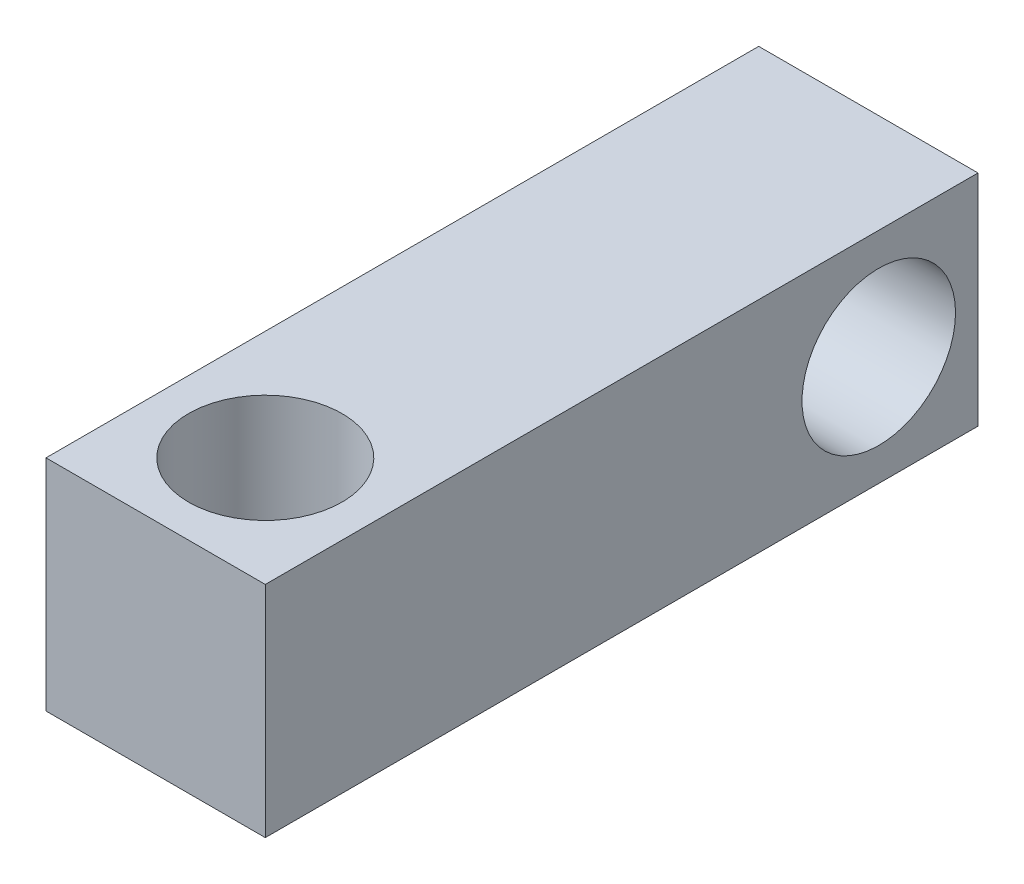
ISO-10303-21;
HEADER;
FILE_DESCRIPTION(('STEP AP214'),'2;1');
FILE_NAME('part.step','',(''),(''),'','','');
FILE_SCHEMA(('AUTOMOTIVE_DESIGN { 1 0 10303 214 1 1 1 1 }'));
ENDSEC;
DATA;
#1=APPLICATION_CONTEXT('core data for automotive mechanical design processes');
#2=APPLICATION_PROTOCOL_DEFINITION('international standard','automotive_design',2000,#1);
#3=PRODUCT_CONTEXT('',#1,'mechanical');
#4=PRODUCT('Part','Part','',(#3));
#5=PRODUCT_RELATED_PRODUCT_CATEGORY('part','',(#4));
#6=PRODUCT_DEFINITION_FORMATION('','',#4);
#7=PRODUCT_DEFINITION_CONTEXT('part definition',#1,'design');
#8=PRODUCT_DEFINITION('design','',#6,#7);
#9=PRODUCT_DEFINITION_SHAPE('','',#8);
#10=(LENGTH_UNIT() NAMED_UNIT(*) SI_UNIT(.MILLI.,.METRE.));
#11=(NAMED_UNIT(*) PLANE_ANGLE_UNIT() SI_UNIT($,.RADIAN.));
#12=(NAMED_UNIT(*) SI_UNIT($,.STERADIAN.) SOLID_ANGLE_UNIT());
#13=UNCERTAINTY_MEASURE_WITH_UNIT(LENGTH_MEASURE(1.E-05),#10,'distance_accuracy_value','');
#14=(GEOMETRIC_REPRESENTATION_CONTEXT(3) GLOBAL_UNCERTAINTY_ASSIGNED_CONTEXT((#13)) GLOBAL_UNIT_ASSIGNED_CONTEXT((#10,
#11,#12)) REPRESENTATION_CONTEXT('',''));
#15=CARTESIAN_POINT('',(0.,0.,0.));
#16=DIRECTION('',(0.,0.,1.));
#17=DIRECTION('',(1.,0.,0.));
#18=AXIS2_PLACEMENT_3D('',#15,#16,#17);
#19=CARTESIAN_POINT('',(10.,-10.,65.));
#20=DIRECTION('',(-1.,0.,0.));
#21=DIRECTION('',(0.,0.,1.));
#22=AXIS2_PLACEMENT_3D('',#19,#20,#21);
#23=PLANE('',#22);
#24=CARTESIAN_POINT('',(10.,0.,9.05014445239366));
#25=DIRECTION('',(1.,0.,0.));
#26=DIRECTION('',(0.,0.,-1.));
#27=AXIS2_PLACEMENT_3D('',#24,#25,#26);
#28=CIRCLE('',#27,7.);
#29=CARTESIAN_POINT('',(10.,0.,2.05014445239366));
#30=VERTEX_POINT('',#29);
#31=EDGE_CURVE('E108',#30,#30,#28,.T.);
#32=ORIENTED_EDGE('',*,*,#31,.F.);
#33=EDGE_LOOP('',(#32));
#34=FACE_BOUND('',#33,.T.);
#35=DIRECTION('',(0.,1.,0.));
#36=VECTOR('',#35,1.);
#37=CARTESIAN_POINT('',(10.,-10.,0.));
#38=LINE('',#37,#36);
#39=CARTESIAN_POINT('',(10.,-10.,0.));
#40=VERTEX_POINT('',#39);
#41=CARTESIAN_POINT('',(10.,10.,0.));
#42=VERTEX_POINT('',#41);
#43=EDGE_CURVE('E99',#40,#42,#38,.T.);
#44=ORIENTED_EDGE('',*,*,#43,.T.);
#45=DIRECTION('',(0.,0.,-1.));
#46=VECTOR('',#45,1.);
#47=CARTESIAN_POINT('',(10.,10.,65.));
#48=LINE('',#47,#46);
#49=CARTESIAN_POINT('',(10.,10.,65.));
#50=VERTEX_POINT('',#49);
#51=EDGE_CURVE('E11',#50,#42,#48,.T.);
#52=ORIENTED_EDGE('',*,*,#51,.F.);
#53=DIRECTION('',(0.,1.,0.));
#54=VECTOR('',#53,1.);
#55=CARTESIAN_POINT('',(10.,-10.,65.));
#56=LINE('',#55,#54);
#57=CARTESIAN_POINT('',(10.,-10.,65.));
#58=VERTEX_POINT('',#57);
#59=EDGE_CURVE('E86',#58,#50,#56,.T.);
#60=ORIENTED_EDGE('',*,*,#59,.F.);
#61=DIRECTION('',(0.,0.,-1.));
#62=VECTOR('',#61,1.);
#63=CARTESIAN_POINT('',(10.,-10.,65.));
#64=LINE('',#63,#62);
#65=EDGE_CURVE('E95',#58,#40,#64,.T.);
#66=ORIENTED_EDGE('',*,*,#65,.T.);
#67=EDGE_LOOP('',(#44,#52,#60,#66));
#68=FACE_BOUND('',#67,.T.);
#69=ADVANCED_FACE('F33',(#34,#68),#23,.F.);
#70=CARTESIAN_POINT('',(-9.99999999999999,10.,65.));
#71=DIRECTION('',(0.,-1.,0.));
#72=DIRECTION('',(0.,0.,-1.));
#73=AXIS2_PLACEMENT_3D('',#70,#71,#72);
#74=PLANE('',#73);
#75=CARTESIAN_POINT('',(0.,10.,55.));
#76=DIRECTION('',(0.,1.,0.));
#77=DIRECTION('',(0.,0.,1.));
#78=AXIS2_PLACEMENT_3D('',#75,#76,#77);
#79=CIRCLE('',#78,7.);
#80=CARTESIAN_POINT('',(0.,10.,62.));
#81=VERTEX_POINT('',#80);
#82=EDGE_CURVE('E116',#81,#81,#79,.T.);
#83=ORIENTED_EDGE('',*,*,#82,.F.);
#84=EDGE_LOOP('',(#83));
#85=FACE_BOUND('',#84,.T.);
#86=DIRECTION('',(-1.,0.,0.));
#87=VECTOR('',#86,1.);
#88=CARTESIAN_POINT('',(-9.99999999999999,10.,0.));
#89=LINE('',#88,#87);
#90=CARTESIAN_POINT('',(-9.99999999999999,10.,0.));
#91=VERTEX_POINT('',#90);
#92=EDGE_CURVE('E90',#42,#91,#89,.T.);
#93=ORIENTED_EDGE('',*,*,#92,.T.);
#94=DIRECTION('',(0.,0.,-1.));
#95=VECTOR('',#94,1.);
#96=CARTESIAN_POINT('',(-9.99999999999999,10.,65.));
#97=LINE('',#96,#95);
#98=CARTESIAN_POINT('',(-9.99999999999999,10.,65.));
#99=VERTEX_POINT('',#98);
#100=EDGE_CURVE('E42',#99,#91,#97,.T.);
#101=ORIENTED_EDGE('',*,*,#100,.F.);
#102=DIRECTION('',(-1.,0.,0.));
#103=VECTOR('',#102,1.);
#104=CARTESIAN_POINT('',(-9.99999999999999,10.,65.));
#105=LINE('',#104,#103);
#106=EDGE_CURVE('E81',#50,#99,#105,.T.);
#107=ORIENTED_EDGE('',*,*,#106,.F.);
#108=ORIENTED_EDGE('',*,*,#51,.T.);
#109=EDGE_LOOP('',(#93,#101,#107,#108));
#110=FACE_BOUND('',#109,.T.);
#111=ADVANCED_FACE('F89',(#85,#110),#74,.F.);
#112=CARTESIAN_POINT('',(-9.99999999999999,-10.,65.));
#113=DIRECTION('',(1.,0.,0.));
#114=DIRECTION('',(0.,0.,-1.));
#115=AXIS2_PLACEMENT_3D('',#112,#113,#114);
#116=PLANE('',#115);
#117=CARTESIAN_POINT('',(-9.99999999999999,0.,9.05014445239366));
#118=DIRECTION('',(1.,0.,0.));
#119=DIRECTION('',(0.,0.,-1.));
#120=AXIS2_PLACEMENT_3D('',#117,#118,#119);
#121=CIRCLE('',#120,7.);
#122=CARTESIAN_POINT('',(-9.99999999999999,0.,2.05014445239366));
#123=VERTEX_POINT('',#122);
#124=EDGE_CURVE('E102',#123,#123,#121,.T.);
#125=ORIENTED_EDGE('',*,*,#124,.T.);
#126=EDGE_LOOP('',(#125));
#127=FACE_BOUND('',#126,.T.);
#128=DIRECTION('',(0.,-1.,0.));
#129=VECTOR('',#128,1.);
#130=CARTESIAN_POINT('',(-9.99999999999999,-10.,0.));
#131=LINE('',#130,#129);
#132=CARTESIAN_POINT('',(-9.99999999999999,-10.,0.));
#133=VERTEX_POINT('',#132);
#134=EDGE_CURVE('E68',#91,#133,#131,.T.);
#135=ORIENTED_EDGE('',*,*,#134,.T.);
#136=DIRECTION('',(0.,0.,-1.));
#137=VECTOR('',#136,1.);
#138=CARTESIAN_POINT('',(-9.99999999999999,-10.,65.));
#139=LINE('',#138,#137);
#140=CARTESIAN_POINT('',(-9.99999999999999,-10.,65.));
#141=VERTEX_POINT('',#140);
#142=EDGE_CURVE('E91',#141,#133,#139,.T.);
#143=ORIENTED_EDGE('',*,*,#142,.F.);
#144=DIRECTION('',(0.,-1.,0.));
#145=VECTOR('',#144,1.);
#146=CARTESIAN_POINT('',(-9.99999999999999,-10.,65.));
#147=LINE('',#146,#145);
#148=EDGE_CURVE('E84',#99,#141,#147,.T.);
#149=ORIENTED_EDGE('',*,*,#148,.F.);
#150=ORIENTED_EDGE('',*,*,#100,.T.);
#151=EDGE_LOOP('',(#135,#143,#149,#150));
#152=FACE_BOUND('',#151,.T.);
#153=ADVANCED_FACE('F93',(#127,#152),#116,.F.);
#154=CARTESIAN_POINT('',(-9.99999999999999,-10.,65.));
#155=DIRECTION('',(0.,1.,0.));
#156=DIRECTION('',(0.,0.,1.));
#157=AXIS2_PLACEMENT_3D('',#154,#155,#156);
#158=PLANE('',#157);
#159=CARTESIAN_POINT('',(0.,-10.,55.));
#160=DIRECTION('',(0.,1.,0.));
#161=DIRECTION('',(0.,0.,1.));
#162=AXIS2_PLACEMENT_3D('',#159,#160,#161);
#163=CIRCLE('',#162,7.);
#164=CARTESIAN_POINT('',(0.,-10.,62.));
#165=VERTEX_POINT('',#164);
#166=EDGE_CURVE('E36',#165,#165,#163,.T.);
#167=ORIENTED_EDGE('',*,*,#166,.T.);
#168=EDGE_LOOP('',(#167));
#169=FACE_BOUND('',#168,.T.);
#170=DIRECTION('',(1.,0.,0.));
#171=VECTOR('',#170,1.);
#172=CARTESIAN_POINT('',(-9.99999999999999,-10.,0.));
#173=LINE('',#172,#171);
#174=EDGE_CURVE('E74',#133,#40,#173,.T.);
#175=ORIENTED_EDGE('',*,*,#174,.T.);
#176=ORIENTED_EDGE('',*,*,#65,.F.);
#177=DIRECTION('',(1.,0.,0.));
#178=VECTOR('',#177,1.);
#179=CARTESIAN_POINT('',(-9.99999999999999,-10.,65.));
#180=LINE('',#179,#178);
#181=EDGE_CURVE('E51',#141,#58,#180,.T.);
#182=ORIENTED_EDGE('',*,*,#181,.F.);
#183=ORIENTED_EDGE('',*,*,#142,.T.);
#184=EDGE_LOOP('',(#175,#176,#182,#183));
#185=FACE_BOUND('',#184,.T.);
#186=ADVANCED_FACE('F129',(#169,#185),#158,.F.);
#187=CARTESIAN_POINT('',(0.,0.,65.));
#188=DIRECTION('',(0.,0.,-1.));
#189=DIRECTION('',(-1.,0.,0.));
#190=AXIS2_PLACEMENT_3D('',#187,#188,#189);
#191=PLANE('',#190);
#192=ORIENTED_EDGE('',*,*,#59,.T.);
#193=ORIENTED_EDGE('',*,*,#106,.T.);
#194=ORIENTED_EDGE('',*,*,#148,.T.);
#195=ORIENTED_EDGE('',*,*,#181,.T.);
#196=EDGE_LOOP('',(#192,#193,#194,#195));
#197=FACE_BOUND('',#196,.T.);
#198=ADVANCED_FACE('F82',(#197),#191,.F.);
#199=CARTESIAN_POINT('',(0.,0.,0.));
#200=DIRECTION('',(0.,0.,-1.));
#201=DIRECTION('',(-1.,0.,0.));
#202=AXIS2_PLACEMENT_3D('',#199,#200,#201);
#203=PLANE('',#202);
#204=ORIENTED_EDGE('',*,*,#43,.F.);
#205=ORIENTED_EDGE('',*,*,#174,.F.);
#206=ORIENTED_EDGE('',*,*,#134,.F.);
#207=ORIENTED_EDGE('',*,*,#92,.F.);
#208=EDGE_LOOP('',(#204,#205,#206,#207));
#209=FACE_BOUND('',#208,.T.);
#210=ADVANCED_FACE('F136',(#209),#203,.T.);
#211=CARTESIAN_POINT('',(-40.,0.,9.05014445239366));
#212=DIRECTION('',(1.,0.,0.));
#213=DIRECTION('',(0.,0.,-1.));
#214=AXIS2_PLACEMENT_3D('',#211,#212,#213);
#215=CYLINDRICAL_SURFACE('',#214,7.);
#216=ORIENTED_EDGE('',*,*,#31,.T.);
#217=EDGE_LOOP('',(#216));
#218=FACE_BOUND('',#217,.T.);
#219=ORIENTED_EDGE('',*,*,#124,.F.);
#220=EDGE_LOOP('',(#219));
#221=FACE_BOUND('',#220,.T.);
#222=ADVANCED_FACE('F139',(#218,#221),#215,.F.);
#223=CARTESIAN_POINT('',(0.,-40.,55.));
#224=DIRECTION('',(0.,1.,0.));
#225=DIRECTION('',(0.,0.,1.));
#226=AXIS2_PLACEMENT_3D('',#223,#224,#225);
#227=CYLINDRICAL_SURFACE('',#226,7.);
#228=ORIENTED_EDGE('',*,*,#82,.T.);
#229=EDGE_LOOP('',(#228));
#230=FACE_BOUND('',#229,.T.);
#231=ORIENTED_EDGE('',*,*,#166,.F.);
#232=EDGE_LOOP('',(#231));
#233=FACE_BOUND('',#232,.T.);
#234=ADVANCED_FACE('F121',(#230,#233),#227,.F.);
#235=CLOSED_SHELL('',(#69,#111,#153,#186,#198,#210,#222,#234));
#236=MANIFOLD_SOLID_BREP('B2',#235);
#237=ADVANCED_BREP_SHAPE_REPRESENTATION('',(#18,#236),#14);
#238=SHAPE_DEFINITION_REPRESENTATION(#9,#237);
ENDSEC;
END-ISO-10303-21;
